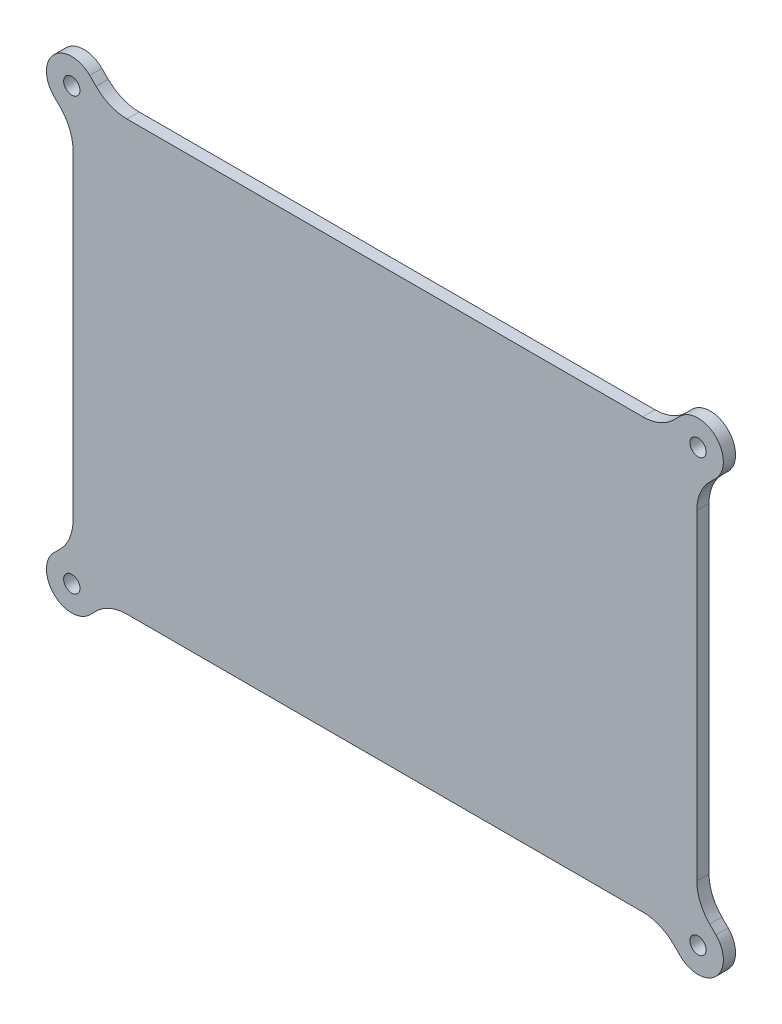
ISO-10303-21;
HEADER;
FILE_DESCRIPTION(('STEP AP214'),'2;1');
FILE_NAME('part.step','',(''),(''),'','','');
FILE_SCHEMA(('AUTOMOTIVE_DESIGN { 1 0 10303 214 1 1 1 1 }'));
ENDSEC;
DATA;
#1=APPLICATION_CONTEXT('core data for automotive mechanical design processes');
#2=APPLICATION_PROTOCOL_DEFINITION('international standard','automotive_design',2000,#1);
#3=PRODUCT_CONTEXT('',#1,'mechanical');
#4=PRODUCT('Part','Part','',(#3));
#5=PRODUCT_RELATED_PRODUCT_CATEGORY('part','',(#4));
#6=PRODUCT_DEFINITION_FORMATION('','',#4);
#7=PRODUCT_DEFINITION_CONTEXT('part definition',#1,'design');
#8=PRODUCT_DEFINITION('design','',#6,#7);
#9=PRODUCT_DEFINITION_SHAPE('','',#8);
#10=(LENGTH_UNIT() NAMED_UNIT(*) SI_UNIT(.MILLI.,.METRE.));
#11=(NAMED_UNIT(*) PLANE_ANGLE_UNIT() SI_UNIT($,.RADIAN.));
#12=(NAMED_UNIT(*) SI_UNIT($,.STERADIAN.) SOLID_ANGLE_UNIT());
#13=UNCERTAINTY_MEASURE_WITH_UNIT(LENGTH_MEASURE(1.E-05),#10,'distance_accuracy_value','');
#14=(GEOMETRIC_REPRESENTATION_CONTEXT(3) GLOBAL_UNCERTAINTY_ASSIGNED_CONTEXT((#13)) GLOBAL_UNIT_ASSIGNED_CONTEXT((#10,
#11,#12)) REPRESENTATION_CONTEXT('',''));
#15=CARTESIAN_POINT('',(0.,0.,0.));
#16=DIRECTION('',(0.,0.,1.));
#17=DIRECTION('',(1.,0.,0.));
#18=AXIS2_PLACEMENT_3D('',#15,#16,#17);
#19=CARTESIAN_POINT('',(-97.9904058691495,44.1022295903228,3.175));
#20=DIRECTION('',(0.,0.,1.));
#21=DIRECTION('',(1.,0.,0.));
#22=AXIS2_PLACEMENT_3D('',#19,#20,#21);
#23=PLANE('',#22);
#24=CARTESIAN_POINT('',(76.3077478034919,-53.8810036649023,3.175));
#25=DIRECTION('',(0.,0.,1.));
#26=DIRECTION('',(1.,0.,0.));
#27=AXIS2_PLACEMENT_3D('',#24,#25,#26);
#28=CIRCLE('',#27,2.125);
#29=CARTESIAN_POINT('',(78.4327478034919,-53.8810036649023,3.175));
#30=VERTEX_POINT('',#29);
#31=EDGE_CURVE('E453',#30,#30,#28,.T.);
#32=ORIENTED_EDGE('',*,*,#31,.F.);
#33=EDGE_LOOP('',(#32));
#34=FACE_BOUND('',#33,.T.);
#35=CARTESIAN_POINT('',(-86.868559541791,58.4953036803807,3.175));
#36=DIRECTION('',(0.,0.,1.));
#37=DIRECTION('',(1.,0.,0.));
#38=AXIS2_PLACEMENT_3D('',#35,#36,#37);
#39=CIRCLE('',#38,2.125);
#40=CARTESIAN_POINT('',(-84.743559541791,58.4953036803807,3.175));
#41=VERTEX_POINT('',#40);
#42=EDGE_CURVE('E236',#41,#41,#39,.T.);
#43=ORIENTED_EDGE('',*,*,#42,.F.);
#44=EDGE_LOOP('',(#43));
#45=FACE_BOUND('',#44,.T.);
#46=CARTESIAN_POINT('',(-97.9904058691495,44.1022295903228,3.175));
#47=DIRECTION('',(0.,0.,-1.));
#48=DIRECTION('',(1.,0.,0.));
#49=AXIS2_PLACEMENT_3D('',#46,#47,#48);
#50=CIRCLE('',#49,11.43);
#51=CARTESIAN_POINT('',(-89.9081753601873,52.1844600992851,3.175));
#52=VERTEX_POINT('',#51);
#53=CARTESIAN_POINT('',(-86.5604058691495,44.1022295903228,3.175));
#54=VERTEX_POINT('',#53);
#55=EDGE_CURVE('E279',#52,#54,#50,.T.);
#56=ORIENTED_EDGE('',*,*,#55,.T.);
#57=DIRECTION('',(0.,-1.,0.));
#58=VECTOR('',#57,1.);
#59=CARTESIAN_POINT('',(-86.5604058691495,44.1022295903228,3.175));
#60=LINE('',#59,#58);
#61=CARTESIAN_POINT('',(-86.5604058691495,-39.4879295748445,3.175));
#62=VERTEX_POINT('',#61);
#63=EDGE_CURVE('E147',#54,#62,#60,.T.);
#64=ORIENTED_EDGE('',*,*,#63,.T.);
#65=CARTESIAN_POINT('',(-97.9904058691495,-39.4879295748445,3.175));
#66=DIRECTION('',(0.,0.,-1.));
#67=DIRECTION('',(1.,0.,0.));
#68=AXIS2_PLACEMENT_3D('',#65,#66,#67);
#69=CIRCLE('',#68,11.43);
#70=CARTESIAN_POINT('',(-89.9081753601873,-47.5701600838067,3.175));
#71=VERTEX_POINT('',#70);
#72=EDGE_CURVE('E342',#62,#71,#69,.T.);
#73=ORIENTED_EDGE('',*,*,#72,.T.);
#74=DIRECTION('',(-0.707106781186546,-0.707106781186549,0.));
#75=VECTOR('',#74,1.);
#76=CARTESIAN_POINT('',(-91.543789241537,-49.2057739651564,3.175));
#77=LINE('',#76,#75);
#78=CARTESIAN_POINT('',(-91.543789241537,-49.2057739651564,3.175));
#79=VERTEX_POINT('',#78);
#80=EDGE_CURVE('E361',#71,#79,#77,.T.);
#81=ORIENTED_EDGE('',*,*,#80,.T.);
#82=CARTESIAN_POINT('',(-86.868559541791,-53.8810036649023,3.175));
#83=DIRECTION('',(0.,0.,1.));
#84=DIRECTION('',(1.,0.,0.));
#85=AXIS2_PLACEMENT_3D('',#82,#83,#84);
#86=CIRCLE('',#85,6.61177324859019);
#87=CARTESIAN_POINT('',(-82.1933298420451,-58.5562333646482,3.175));
#88=VERTEX_POINT('',#87);
#89=EDGE_CURVE('E358',#79,#88,#86,.T.);
#90=ORIENTED_EDGE('',*,*,#89,.T.);
#91=DIRECTION('',(0.707106781186548,0.707106781186548,0.));
#92=VECTOR('',#91,1.);
#93=CARTESIAN_POINT('',(-82.1933298420451,-58.5562333646482,3.175));
#94=LINE('',#93,#92);
#95=CARTESIAN_POINT('',(-80.5577159606955,-56.9206194832986,3.175));
#96=VERTEX_POINT('',#95);
#97=EDGE_CURVE('E360',#88,#96,#94,.T.);
#98=ORIENTED_EDGE('',*,*,#97,.T.);
#99=CARTESIAN_POINT('',(-72.4754854517332,-65.0028499922608,3.175));
#100=DIRECTION('',(0.,0.,-1.));
#101=DIRECTION('',(1.,0.,0.));
#102=AXIS2_PLACEMENT_3D('',#99,#100,#101);
#103=CIRCLE('',#102,11.43);
#104=CARTESIAN_POINT('',(-72.4754854517333,-53.5728499922608,3.175));
#105=VERTEX_POINT('',#104);
#106=EDGE_CURVE('E363',#96,#105,#103,.T.);
#107=ORIENTED_EDGE('',*,*,#106,.T.);
#108=DIRECTION('',(1.,0.,0.));
#109=VECTOR('',#108,1.);
#110=CARTESIAN_POINT('',(61.9146737134341,-53.5728499922608,3.175));
#111=LINE('',#110,#109);
#112=CARTESIAN_POINT('',(61.9146737134341,-53.5728499922608,3.175));
#113=VERTEX_POINT('',#112);
#114=EDGE_CURVE('E369',#105,#113,#111,.T.);
#115=ORIENTED_EDGE('',*,*,#114,.T.);
#116=CARTESIAN_POINT('',(61.9146737134341,-65.0028499922608,3.175));
#117=DIRECTION('',(0.,0.,-1.));
#118=DIRECTION('',(1.,0.,0.));
#119=AXIS2_PLACEMENT_3D('',#116,#117,#118);
#120=CIRCLE('',#119,11.43);
#121=CARTESIAN_POINT('',(69.9969042223963,-56.9206194832986,3.175));
#122=VERTEX_POINT('',#121);
#123=EDGE_CURVE('E371',#113,#122,#120,.T.);
#124=ORIENTED_EDGE('',*,*,#123,.T.);
#125=DIRECTION('',(0.707106781186548,-0.707106781186548,0.));
#126=VECTOR('',#125,1.);
#127=CARTESIAN_POINT('',(71.632518103746,-58.5562333646482,3.175));
#128=LINE('',#127,#126);
#129=CARTESIAN_POINT('',(71.632518103746,-58.5562333646482,3.175));
#130=VERTEX_POINT('',#129);
#131=EDGE_CURVE('E373',#122,#130,#128,.T.);
#132=ORIENTED_EDGE('',*,*,#131,.T.);
#133=CARTESIAN_POINT('',(76.3077478034919,-53.8810036649023,3.175));
#134=DIRECTION('',(0.,0.,1.));
#135=DIRECTION('',(1.,0.,0.));
#136=AXIS2_PLACEMENT_3D('',#133,#134,#135);
#137=CIRCLE('',#136,6.61177324859019);
#138=CARTESIAN_POINT('',(80.9829775032378,-49.2057739651564,3.175));
#139=VERTEX_POINT('',#138);
#140=EDGE_CURVE('E375',#130,#139,#137,.T.);
#141=ORIENTED_EDGE('',*,*,#140,.T.);
#142=DIRECTION('',(-0.707106781186546,0.707106781186549,0.));
#143=VECTOR('',#142,1.);
#144=CARTESIAN_POINT('',(80.9829775032378,-49.2057739651564,3.175));
#145=LINE('',#144,#143);
#146=CARTESIAN_POINT('',(79.3473636218882,-47.5701600838068,3.175));
#147=VERTEX_POINT('',#146);
#148=EDGE_CURVE('E377',#139,#147,#145,.T.);
#149=ORIENTED_EDGE('',*,*,#148,.T.);
#150=CARTESIAN_POINT('',(87.4295941308505,-39.4879295748445,3.175));
#151=DIRECTION('',(0.,0.,-1.));
#152=DIRECTION('',(1.,0.,0.));
#153=AXIS2_PLACEMENT_3D('',#150,#151,#152);
#154=CIRCLE('',#153,11.43);
#155=CARTESIAN_POINT('',(75.9995941308505,-39.4879295748445,3.175));
#156=VERTEX_POINT('',#155);
#157=EDGE_CURVE('E379',#147,#156,#154,.T.);
#158=ORIENTED_EDGE('',*,*,#157,.T.);
#159=DIRECTION('',(0.,1.,0.));
#160=VECTOR('',#159,1.);
#161=CARTESIAN_POINT('',(75.9995941308505,44.1022295903229,3.175));
#162=LINE('',#161,#160);
#163=CARTESIAN_POINT('',(75.9995941308505,44.1022295903229,3.175));
#164=VERTEX_POINT('',#163);
#165=EDGE_CURVE('E381',#156,#164,#162,.T.);
#166=ORIENTED_EDGE('',*,*,#165,.T.);
#167=CARTESIAN_POINT('',(87.4295941308505,44.1022295903229,3.175));
#168=DIRECTION('',(0.,0.,-1.));
#169=DIRECTION('',(1.,0.,0.));
#170=AXIS2_PLACEMENT_3D('',#167,#168,#169);
#171=CIRCLE('',#170,11.43);
#172=CARTESIAN_POINT('',(79.3473636218882,52.1844600992851,3.175));
#173=VERTEX_POINT('',#172);
#174=EDGE_CURVE('E383',#164,#173,#171,.T.);
#175=ORIENTED_EDGE('',*,*,#174,.T.);
#176=DIRECTION('',(0.707106781186548,0.707106781186548,0.));
#177=VECTOR('',#176,1.);
#178=CARTESIAN_POINT('',(80.9829775032378,53.8200739806347,3.175));
#179=LINE('',#178,#177);
#180=CARTESIAN_POINT('',(80.9829775032378,53.8200739806347,3.175));
#181=VERTEX_POINT('',#180);
#182=EDGE_CURVE('E385',#173,#181,#179,.T.);
#183=ORIENTED_EDGE('',*,*,#182,.T.);
#184=CARTESIAN_POINT('',(76.3077478034919,58.4953036803807,3.175));
#185=DIRECTION('',(0.,0.,1.));
#186=DIRECTION('',(1.,0.,0.));
#187=AXIS2_PLACEMENT_3D('',#184,#185,#186);
#188=CIRCLE('',#187,6.61177324859019);
#189=CARTESIAN_POINT('',(71.632518103746,63.1705333801266,3.175));
#190=VERTEX_POINT('',#189);
#191=EDGE_CURVE('E387',#181,#190,#188,.T.);
#192=ORIENTED_EDGE('',*,*,#191,.T.);
#193=DIRECTION('',(-0.707106781186546,-0.707106781186549,0.));
#194=VECTOR('',#193,1.);
#195=CARTESIAN_POINT('',(71.632518103746,63.1705333801266,3.175));
#196=LINE('',#195,#194);
#197=CARTESIAN_POINT('',(69.9969042223963,61.534919498777,3.175));
#198=VERTEX_POINT('',#197);
#199=EDGE_CURVE('E389',#190,#198,#196,.T.);
#200=ORIENTED_EDGE('',*,*,#199,.T.);
#201=CARTESIAN_POINT('',(61.9146737134341,69.6171500077392,3.175));
#202=DIRECTION('',(0.,0.,-1.));
#203=DIRECTION('',(1.,0.,0.));
#204=AXIS2_PLACEMENT_3D('',#201,#202,#203);
#205=CIRCLE('',#204,11.43);
#206=CARTESIAN_POINT('',(61.9146737134341,58.1871500077392,3.175));
#207=VERTEX_POINT('',#206);
#208=EDGE_CURVE('E391',#198,#207,#205,.T.);
#209=ORIENTED_EDGE('',*,*,#208,.T.);
#210=DIRECTION('',(-1.,0.,0.));
#211=VECTOR('',#210,1.);
#212=CARTESIAN_POINT('',(61.9146737134341,58.1871500077392,3.175));
#213=LINE('',#212,#211);
#214=CARTESIAN_POINT('',(-72.4754854517332,58.1871500077392,3.175));
#215=VERTEX_POINT('',#214);
#216=EDGE_CURVE('E393',#207,#215,#213,.T.);
#217=ORIENTED_EDGE('',*,*,#216,.T.);
#218=CARTESIAN_POINT('',(-72.4754854517332,69.6171500077392,3.175));
#219=DIRECTION('',(0.,0.,-1.));
#220=DIRECTION('',(1.,0.,0.));
#221=AXIS2_PLACEMENT_3D('',#218,#219,#220);
#222=CIRCLE('',#221,11.43);
#223=CARTESIAN_POINT('',(-80.5577159606955,61.5349194987769,3.175));
#224=VERTEX_POINT('',#223);
#225=EDGE_CURVE('E214',#215,#224,#222,.T.);
#226=ORIENTED_EDGE('',*,*,#225,.T.);
#227=DIRECTION('',(-0.707106781186546,0.707106781186549,0.));
#228=VECTOR('',#227,1.);
#229=CARTESIAN_POINT('',(-82.1933298420451,63.1705333801266,3.175));
#230=LINE('',#229,#228);
#231=CARTESIAN_POINT('',(-82.1933298420451,63.1705333801266,3.175));
#232=VERTEX_POINT('',#231);
#233=EDGE_CURVE('E208',#224,#232,#230,.T.);
#234=ORIENTED_EDGE('',*,*,#233,.T.);
#235=CARTESIAN_POINT('',(-86.868559541791,58.4953036803807,3.175));
#236=DIRECTION('',(0.,0.,1.));
#237=DIRECTION('',(1.,0.,0.));
#238=AXIS2_PLACEMENT_3D('',#235,#236,#237);
#239=CIRCLE('',#238,6.61177324859019);
#240=CARTESIAN_POINT('',(-91.543789241537,53.8200739806347,3.175));
#241=VERTEX_POINT('',#240);
#242=EDGE_CURVE('E212',#232,#241,#239,.T.);
#243=ORIENTED_EDGE('',*,*,#242,.T.);
#244=DIRECTION('',(0.707106781186548,-0.707106781186548,0.));
#245=VECTOR('',#244,1.);
#246=CARTESIAN_POINT('',(-91.543789241537,53.8200739806347,3.175));
#247=LINE('',#246,#245);
#248=EDGE_CURVE('E56',#241,#52,#247,.T.);
#249=ORIENTED_EDGE('',*,*,#248,.T.);
#250=EDGE_LOOP('',(#56,#64,#73,#81,#90,#98,#107,#115,#124,#132,#141,#149,#158,#166,#175,#183,
#192,#200,#209,#217,#226,#234,#243,#249));
#251=FACE_BOUND('',#250,.T.);
#252=CARTESIAN_POINT('',(76.3077478034919,58.4953036803807,3.175));
#253=DIRECTION('',(0.,0.,1.));
#254=DIRECTION('',(1.,0.,0.));
#255=AXIS2_PLACEMENT_3D('',#252,#253,#254);
#256=CIRCLE('',#255,2.125);
#257=CARTESIAN_POINT('',(78.4327478034919,58.4953036803807,3.175));
#258=VERTEX_POINT('',#257);
#259=EDGE_CURVE('E459',#258,#258,#256,.T.);
#260=ORIENTED_EDGE('',*,*,#259,.F.);
#261=EDGE_LOOP('',(#260));
#262=FACE_BOUND('',#261,.T.);
#263=CARTESIAN_POINT('',(-86.868559541791,-53.8810036649023,3.175));
#264=DIRECTION('',(0.,0.,1.));
#265=DIRECTION('',(1.,0.,0.));
#266=AXIS2_PLACEMENT_3D('',#263,#264,#265);
#267=CIRCLE('',#266,2.125);
#268=CARTESIAN_POINT('',(-84.743559541791,-53.8810036649023,3.175));
#269=VERTEX_POINT('',#268);
#270=EDGE_CURVE('E444',#269,#269,#267,.T.);
#271=ORIENTED_EDGE('',*,*,#270,.F.);
#272=EDGE_LOOP('',(#271));
#273=FACE_BOUND('',#272,.T.);
#274=ADVANCED_FACE('F39',(#34,#45,#251,#262,#273),#23,.T.);
#275=CARTESIAN_POINT('',(-97.9904058691495,44.1022295903228,0.));
#276=DIRECTION('',(0.,0.,1.));
#277=DIRECTION('',(1.,0.,0.));
#278=AXIS2_PLACEMENT_3D('',#275,#276,#277);
#279=PLANE('',#278);
#280=CARTESIAN_POINT('',(-97.9904058691495,44.1022295903228,0.));
#281=DIRECTION('',(0.,0.,-1.));
#282=DIRECTION('',(1.,0.,0.));
#283=AXIS2_PLACEMENT_3D('',#280,#281,#282);
#284=CIRCLE('',#283,11.43);
#285=CARTESIAN_POINT('',(-89.9081753601873,52.1844600992851,0.));
#286=VERTEX_POINT('',#285);
#287=CARTESIAN_POINT('',(-86.5604058691495,44.1022295903228,0.));
#288=VERTEX_POINT('',#287);
#289=EDGE_CURVE('E232',#286,#288,#284,.T.);
#290=ORIENTED_EDGE('',*,*,#289,.F.);
#291=DIRECTION('',(0.707106781186548,-0.707106781186548,0.));
#292=VECTOR('',#291,1.);
#293=CARTESIAN_POINT('',(-91.543789241537,53.8200739806347,0.));
#294=LINE('',#293,#292);
#295=CARTESIAN_POINT('',(-91.543789241537,53.8200739806347,0.));
#296=VERTEX_POINT('',#295);
#297=EDGE_CURVE('E139',#296,#286,#294,.T.);
#298=ORIENTED_EDGE('',*,*,#297,.F.);
#299=CARTESIAN_POINT('',(-86.868559541791,58.4953036803807,0.));
#300=DIRECTION('',(0.,0.,1.));
#301=DIRECTION('',(1.,0.,0.));
#302=AXIS2_PLACEMENT_3D('',#299,#300,#301);
#303=CIRCLE('',#302,6.61177324859019);
#304=CARTESIAN_POINT('',(-82.1933298420451,63.1705333801266,0.));
#305=VERTEX_POINT('',#304);
#306=EDGE_CURVE('E133',#305,#296,#303,.T.);
#307=ORIENTED_EDGE('',*,*,#306,.F.);
#308=DIRECTION('',(-0.707106781186546,0.707106781186549,0.));
#309=VECTOR('',#308,1.);
#310=CARTESIAN_POINT('',(-82.1933298420451,63.1705333801266,0.));
#311=LINE('',#310,#309);
#312=CARTESIAN_POINT('',(-80.5577159606955,61.5349194987769,0.));
#313=VERTEX_POINT('',#312);
#314=EDGE_CURVE('E222',#313,#305,#311,.T.);
#315=ORIENTED_EDGE('',*,*,#314,.F.);
#316=CARTESIAN_POINT('',(-72.4754854517332,69.6171500077392,0.));
#317=DIRECTION('',(0.,0.,-1.));
#318=DIRECTION('',(1.,0.,0.));
#319=AXIS2_PLACEMENT_3D('',#316,#317,#318);
#320=CIRCLE('',#319,11.43);
#321=CARTESIAN_POINT('',(-72.4754854517332,58.1871500077392,0.));
#322=VERTEX_POINT('',#321);
#323=EDGE_CURVE('E274',#322,#313,#320,.T.);
#324=ORIENTED_EDGE('',*,*,#323,.F.);
#325=DIRECTION('',(-1.,0.,0.));
#326=VECTOR('',#325,1.);
#327=CARTESIAN_POINT('',(61.9146737134341,58.1871500077392,0.));
#328=LINE('',#327,#326);
#329=CARTESIAN_POINT('',(61.9146737134341,58.1871500077392,0.));
#330=VERTEX_POINT('',#329);
#331=EDGE_CURVE('E272',#330,#322,#328,.T.);
#332=ORIENTED_EDGE('',*,*,#331,.F.);
#333=CARTESIAN_POINT('',(61.9146737134341,69.6171500077392,0.));
#334=DIRECTION('',(0.,0.,-1.));
#335=DIRECTION('',(1.,0.,0.));
#336=AXIS2_PLACEMENT_3D('',#333,#334,#335);
#337=CIRCLE('',#336,11.43);
#338=CARTESIAN_POINT('',(69.9969042223963,61.534919498777,0.));
#339=VERTEX_POINT('',#338);
#340=EDGE_CURVE('E270',#339,#330,#337,.T.);
#341=ORIENTED_EDGE('',*,*,#340,.F.);
#342=DIRECTION('',(-0.707106781186546,-0.707106781186549,0.));
#343=VECTOR('',#342,1.);
#344=CARTESIAN_POINT('',(71.632518103746,63.1705333801266,0.));
#345=LINE('',#344,#343);
#346=CARTESIAN_POINT('',(71.632518103746,63.1705333801266,0.));
#347=VERTEX_POINT('',#346);
#348=EDGE_CURVE('E268',#347,#339,#345,.T.);
#349=ORIENTED_EDGE('',*,*,#348,.F.);
#350=CARTESIAN_POINT('',(76.3077478034919,58.4953036803807,0.));
#351=DIRECTION('',(0.,0.,1.));
#352=DIRECTION('',(1.,0.,0.));
#353=AXIS2_PLACEMENT_3D('',#350,#351,#352);
#354=CIRCLE('',#353,6.61177324859019);
#355=CARTESIAN_POINT('',(80.9829775032378,53.8200739806347,0.));
#356=VERTEX_POINT('',#355);
#357=EDGE_CURVE('E266',#356,#347,#354,.T.);
#358=ORIENTED_EDGE('',*,*,#357,.F.);
#359=DIRECTION('',(0.707106781186548,0.707106781186548,0.));
#360=VECTOR('',#359,1.);
#361=CARTESIAN_POINT('',(80.9829775032378,53.8200739806347,0.));
#362=LINE('',#361,#360);
#363=CARTESIAN_POINT('',(79.3473636218882,52.1844600992851,0.));
#364=VERTEX_POINT('',#363);
#365=EDGE_CURVE('E264',#364,#356,#362,.T.);
#366=ORIENTED_EDGE('',*,*,#365,.F.);
#367=CARTESIAN_POINT('',(87.4295941308505,44.1022295903229,0.));
#368=DIRECTION('',(0.,0.,-1.));
#369=DIRECTION('',(1.,0.,0.));
#370=AXIS2_PLACEMENT_3D('',#367,#368,#369);
#371=CIRCLE('',#370,11.43);
#372=CARTESIAN_POINT('',(75.9995941308505,44.1022295903229,0.));
#373=VERTEX_POINT('',#372);
#374=EDGE_CURVE('E262',#373,#364,#371,.T.);
#375=ORIENTED_EDGE('',*,*,#374,.F.);
#376=DIRECTION('',(0.,1.,0.));
#377=VECTOR('',#376,1.);
#378=CARTESIAN_POINT('',(75.9995941308505,44.1022295903229,0.));
#379=LINE('',#378,#377);
#380=CARTESIAN_POINT('',(75.9995941308505,-39.4879295748445,0.));
#381=VERTEX_POINT('',#380);
#382=EDGE_CURVE('E260',#381,#373,#379,.T.);
#383=ORIENTED_EDGE('',*,*,#382,.F.);
#384=CARTESIAN_POINT('',(87.4295941308505,-39.4879295748445,0.));
#385=DIRECTION('',(0.,0.,-1.));
#386=DIRECTION('',(1.,0.,0.));
#387=AXIS2_PLACEMENT_3D('',#384,#385,#386);
#388=CIRCLE('',#387,11.43);
#389=CARTESIAN_POINT('',(79.3473636218882,-47.5701600838068,0.));
#390=VERTEX_POINT('',#389);
#391=EDGE_CURVE('E258',#390,#381,#388,.T.);
#392=ORIENTED_EDGE('',*,*,#391,.F.);
#393=DIRECTION('',(-0.707106781186546,0.707106781186549,0.));
#394=VECTOR('',#393,1.);
#395=CARTESIAN_POINT('',(80.9829775032378,-49.2057739651564,0.));
#396=LINE('',#395,#394);
#397=CARTESIAN_POINT('',(80.9829775032378,-49.2057739651564,0.));
#398=VERTEX_POINT('',#397);
#399=EDGE_CURVE('E256',#398,#390,#396,.T.);
#400=ORIENTED_EDGE('',*,*,#399,.F.);
#401=CARTESIAN_POINT('',(76.3077478034919,-53.8810036649023,0.));
#402=DIRECTION('',(0.,0.,1.));
#403=DIRECTION('',(1.,0.,0.));
#404=AXIS2_PLACEMENT_3D('',#401,#402,#403);
#405=CIRCLE('',#404,6.61177324859019);
#406=CARTESIAN_POINT('',(71.632518103746,-58.5562333646482,0.));
#407=VERTEX_POINT('',#406);
#408=EDGE_CURVE('E254',#407,#398,#405,.T.);
#409=ORIENTED_EDGE('',*,*,#408,.F.);
#410=DIRECTION('',(0.707106781186548,-0.707106781186548,0.));
#411=VECTOR('',#410,1.);
#412=CARTESIAN_POINT('',(71.632518103746,-58.5562333646482,0.));
#413=LINE('',#412,#411);
#414=CARTESIAN_POINT('',(69.9969042223963,-56.9206194832986,0.));
#415=VERTEX_POINT('',#414);
#416=EDGE_CURVE('E252',#415,#407,#413,.T.);
#417=ORIENTED_EDGE('',*,*,#416,.F.);
#418=CARTESIAN_POINT('',(61.9146737134341,-65.0028499922608,0.));
#419=DIRECTION('',(0.,0.,-1.));
#420=DIRECTION('',(1.,0.,0.));
#421=AXIS2_PLACEMENT_3D('',#418,#419,#420);
#422=CIRCLE('',#421,11.43);
#423=CARTESIAN_POINT('',(61.9146737134341,-53.5728499922608,0.));
#424=VERTEX_POINT('',#423);
#425=EDGE_CURVE('E250',#424,#415,#422,.T.);
#426=ORIENTED_EDGE('',*,*,#425,.F.);
#427=DIRECTION('',(1.,0.,0.));
#428=VECTOR('',#427,1.);
#429=CARTESIAN_POINT('',(61.9146737134341,-53.5728499922608,0.));
#430=LINE('',#429,#428);
#431=CARTESIAN_POINT('',(-72.4754854517333,-53.5728499922608,0.));
#432=VERTEX_POINT('',#431);
#433=EDGE_CURVE('E248',#432,#424,#430,.T.);
#434=ORIENTED_EDGE('',*,*,#433,.F.);
#435=CARTESIAN_POINT('',(-72.4754854517332,-65.0028499922608,0.));
#436=DIRECTION('',(0.,0.,-1.));
#437=DIRECTION('',(1.,0.,0.));
#438=AXIS2_PLACEMENT_3D('',#435,#436,#437);
#439=CIRCLE('',#438,11.43);
#440=CARTESIAN_POINT('',(-80.5577159606955,-56.9206194832986,0.));
#441=VERTEX_POINT('',#440);
#442=EDGE_CURVE('E246',#441,#432,#439,.T.);
#443=ORIENTED_EDGE('',*,*,#442,.F.);
#444=DIRECTION('',(0.707106781186548,0.707106781186548,0.));
#445=VECTOR('',#444,1.);
#446=CARTESIAN_POINT('',(-82.1933298420451,-58.5562333646482,0.));
#447=LINE('',#446,#445);
#448=CARTESIAN_POINT('',(-82.1933298420451,-58.5562333646482,0.));
#449=VERTEX_POINT('',#448);
#450=EDGE_CURVE('E244',#449,#441,#447,.T.);
#451=ORIENTED_EDGE('',*,*,#450,.F.);
#452=CARTESIAN_POINT('',(-86.868559541791,-53.8810036649023,0.));
#453=DIRECTION('',(0.,0.,1.));
#454=DIRECTION('',(1.,0.,0.));
#455=AXIS2_PLACEMENT_3D('',#452,#453,#454);
#456=CIRCLE('',#455,6.61177324859019);
#457=CARTESIAN_POINT('',(-91.543789241537,-49.2057739651564,0.));
#458=VERTEX_POINT('',#457);
#459=EDGE_CURVE('E242',#458,#449,#456,.T.);
#460=ORIENTED_EDGE('',*,*,#459,.F.);
#461=DIRECTION('',(-0.707106781186546,-0.707106781186549,0.));
#462=VECTOR('',#461,1.);
#463=CARTESIAN_POINT('',(-91.543789241537,-49.2057739651564,0.));
#464=LINE('',#463,#462);
#465=CARTESIAN_POINT('',(-89.9081753601873,-47.5701600838067,0.));
#466=VERTEX_POINT('',#465);
#467=EDGE_CURVE('E240',#466,#458,#464,.T.);
#468=ORIENTED_EDGE('',*,*,#467,.F.);
#469=CARTESIAN_POINT('',(-97.9904058691495,-39.4879295748445,0.));
#470=DIRECTION('',(0.,0.,-1.));
#471=DIRECTION('',(1.,0.,0.));
#472=AXIS2_PLACEMENT_3D('',#469,#470,#471);
#473=CIRCLE('',#472,11.43);
#474=CARTESIAN_POINT('',(-86.5604058691495,-39.4879295748445,0.));
#475=VERTEX_POINT('',#474);
#476=EDGE_CURVE('E238',#475,#466,#473,.T.);
#477=ORIENTED_EDGE('',*,*,#476,.F.);
#478=DIRECTION('',(0.,-1.,0.));
#479=VECTOR('',#478,1.);
#480=CARTESIAN_POINT('',(-86.5604058691495,44.1022295903228,0.));
#481=LINE('',#480,#479);
#482=EDGE_CURVE('E235',#288,#475,#481,.T.);
#483=ORIENTED_EDGE('',*,*,#482,.F.);
#484=EDGE_LOOP('',(#290,#298,#307,#315,#324,#332,#341,#349,#358,#366,#375,#383,#392,#400,#409,
#417,#426,#434,#443,#451,#460,#468,#477,#483));
#485=FACE_BOUND('',#484,.T.);
#486=CARTESIAN_POINT('',(-86.868559541791,58.4953036803807,0.));
#487=DIRECTION('',(0.,0.,1.));
#488=DIRECTION('',(1.,0.,0.));
#489=AXIS2_PLACEMENT_3D('',#486,#487,#488);
#490=CIRCLE('',#489,2.125);
#491=CARTESIAN_POINT('',(-84.743559541791,58.4953036803807,0.));
#492=VERTEX_POINT('',#491);
#493=EDGE_CURVE('E462',#492,#492,#490,.T.);
#494=ORIENTED_EDGE('',*,*,#493,.T.);
#495=EDGE_LOOP('',(#494));
#496=FACE_BOUND('',#495,.T.);
#497=CARTESIAN_POINT('',(76.3077478034919,58.4953036803807,0.));
#498=DIRECTION('',(0.,0.,1.));
#499=DIRECTION('',(1.,0.,0.));
#500=AXIS2_PLACEMENT_3D('',#497,#498,#499);
#501=CIRCLE('',#500,2.125);
#502=CARTESIAN_POINT('',(78.4327478034919,58.4953036803807,0.));
#503=VERTEX_POINT('',#502);
#504=EDGE_CURVE('E456',#503,#503,#501,.T.);
#505=ORIENTED_EDGE('',*,*,#504,.T.);
#506=EDGE_LOOP('',(#505));
#507=FACE_BOUND('',#506,.T.);
#508=CARTESIAN_POINT('',(76.3077478034919,-53.8810036649023,0.));
#509=DIRECTION('',(0.,0.,1.));
#510=DIRECTION('',(1.,0.,0.));
#511=AXIS2_PLACEMENT_3D('',#508,#509,#510);
#512=CIRCLE('',#511,2.125);
#513=CARTESIAN_POINT('',(78.4327478034919,-53.8810036649023,0.));
#514=VERTEX_POINT('',#513);
#515=EDGE_CURVE('E450',#514,#514,#512,.T.);
#516=ORIENTED_EDGE('',*,*,#515,.T.);
#517=EDGE_LOOP('',(#516));
#518=FACE_BOUND('',#517,.T.);
#519=CARTESIAN_POINT('',(-86.868559541791,-53.8810036649023,0.));
#520=DIRECTION('',(0.,0.,1.));
#521=DIRECTION('',(1.,0.,0.));
#522=AXIS2_PLACEMENT_3D('',#519,#520,#521);
#523=CIRCLE('',#522,2.125);
#524=CARTESIAN_POINT('',(-84.743559541791,-53.8810036649023,0.));
#525=VERTEX_POINT('',#524);
#526=EDGE_CURVE('E447',#525,#525,#523,.T.);
#527=ORIENTED_EDGE('',*,*,#526,.T.);
#528=EDGE_LOOP('',(#527));
#529=FACE_BOUND('',#528,.T.);
#530=ADVANCED_FACE('F346',(#485,#496,#507,#518,#529),#279,.F.);
#531=CARTESIAN_POINT('',(-97.9904058691495,44.1022295903228,3.175));
#532=DIRECTION('',(0.,0.,-1.));
#533=DIRECTION('',(-1.,0.,0.));
#534=AXIS2_PLACEMENT_3D('',#531,#532,#533);
#535=CYLINDRICAL_SURFACE('',#534,11.43);
#536=ORIENTED_EDGE('',*,*,#289,.T.);
#537=DIRECTION('',(0.,0.,-1.));
#538=VECTOR('',#537,1.);
#539=CARTESIAN_POINT('',(-86.5604058691495,44.1022295903228,3.175));
#540=LINE('',#539,#538);
#541=EDGE_CURVE('E11',#54,#288,#540,.T.);
#542=ORIENTED_EDGE('',*,*,#541,.F.);
#543=ORIENTED_EDGE('',*,*,#55,.F.);
#544=DIRECTION('',(0.,0.,-1.));
#545=VECTOR('',#544,1.);
#546=CARTESIAN_POINT('',(-89.9081753601873,52.1844600992851,3.175));
#547=LINE('',#546,#545);
#548=EDGE_CURVE('E228',#52,#286,#547,.T.);
#549=ORIENTED_EDGE('',*,*,#548,.T.);
#550=EDGE_LOOP('',(#536,#542,#543,#549));
#551=FACE_BOUND('',#550,.T.);
#552=ADVANCED_FACE('F41',(#551),#535,.F.);
#553=CARTESIAN_POINT('',(-86.5604058691495,44.1022295903228,3.175));
#554=DIRECTION('',(1.,0.,0.));
#555=DIRECTION('',(0.,1.,0.));
#556=AXIS2_PLACEMENT_3D('',#553,#554,#555);
#557=PLANE('',#556);
#558=ORIENTED_EDGE('',*,*,#482,.T.);
#559=DIRECTION('',(0.,0.,-1.));
#560=VECTOR('',#559,1.);
#561=CARTESIAN_POINT('',(-86.5604058691495,-39.4879295748445,3.175));
#562=LINE('',#561,#560);
#563=EDGE_CURVE('E48',#62,#475,#562,.T.);
#564=ORIENTED_EDGE('',*,*,#563,.F.);
#565=ORIENTED_EDGE('',*,*,#63,.F.);
#566=ORIENTED_EDGE('',*,*,#541,.T.);
#567=EDGE_LOOP('',(#558,#564,#565,#566));
#568=FACE_BOUND('',#567,.T.);
#569=ADVANCED_FACE('F696',(#568),#557,.F.);
#570=CARTESIAN_POINT('',(-97.9904058691495,-39.4879295748445,3.175));
#571=DIRECTION('',(0.,0.,-1.));
#572=DIRECTION('',(-1.,0.,0.));
#573=AXIS2_PLACEMENT_3D('',#570,#571,#572);
#574=CYLINDRICAL_SURFACE('',#573,11.43);
#575=ORIENTED_EDGE('',*,*,#476,.T.);
#576=DIRECTION('',(0.,0.,-1.));
#577=VECTOR('',#576,1.);
#578=CARTESIAN_POINT('',(-89.9081753601873,-47.5701600838067,3.175));
#579=LINE('',#578,#577);
#580=EDGE_CURVE('E334',#71,#466,#579,.T.);
#581=ORIENTED_EDGE('',*,*,#580,.F.);
#582=ORIENTED_EDGE('',*,*,#72,.F.);
#583=ORIENTED_EDGE('',*,*,#563,.T.);
#584=EDGE_LOOP('',(#575,#581,#582,#583));
#585=FACE_BOUND('',#584,.T.);
#586=ADVANCED_FACE('F340',(#585),#574,.F.);
#587=CARTESIAN_POINT('',(-91.543789241537,-49.2057739651564,3.175));
#588=DIRECTION('',(0.707106781186549,-0.707106781186546,0.));
#589=DIRECTION('',(0.707106781186546,0.707106781186549,0.));
#590=AXIS2_PLACEMENT_3D('',#587,#588,#589);
#591=PLANE('',#590);
#592=ORIENTED_EDGE('',*,*,#467,.T.);
#593=DIRECTION('',(0.,0.,-1.));
#594=VECTOR('',#593,1.);
#595=CARTESIAN_POINT('',(-91.543789241537,-49.2057739651564,3.175));
#596=LINE('',#595,#594);
#597=EDGE_CURVE('E331',#79,#458,#596,.T.);
#598=ORIENTED_EDGE('',*,*,#597,.F.);
#599=ORIENTED_EDGE('',*,*,#80,.F.);
#600=ORIENTED_EDGE('',*,*,#580,.T.);
#601=EDGE_LOOP('',(#592,#598,#599,#600));
#602=FACE_BOUND('',#601,.T.);
#603=ADVANCED_FACE('F352',(#602),#591,.F.);
#604=CARTESIAN_POINT('',(-86.868559541791,-53.8810036649023,3.175));
#605=DIRECTION('',(0.,0.,-1.));
#606=DIRECTION('',(-1.,0.,0.));
#607=AXIS2_PLACEMENT_3D('',#604,#605,#606);
#608=CYLINDRICAL_SURFACE('',#607,6.61177324859019);
#609=ORIENTED_EDGE('',*,*,#459,.T.);
#610=DIRECTION('',(0.,0.,-1.));
#611=VECTOR('',#610,1.);
#612=CARTESIAN_POINT('',(-82.1933298420451,-58.5562333646482,3.175));
#613=LINE('',#612,#611);
#614=EDGE_CURVE('E328',#88,#449,#613,.T.);
#615=ORIENTED_EDGE('',*,*,#614,.F.);
#616=ORIENTED_EDGE('',*,*,#89,.F.);
#617=ORIENTED_EDGE('',*,*,#597,.T.);
#618=EDGE_LOOP('',(#609,#615,#616,#617));
#619=FACE_BOUND('',#618,.T.);
#620=ADVANCED_FACE('F356',(#619),#608,.T.);
#621=CARTESIAN_POINT('',(-82.1933298420451,-58.5562333646482,3.175));
#622=DIRECTION('',(-0.707106781186548,0.707106781186548,0.));
#623=DIRECTION('',(-0.707106781186548,-0.707106781186548,0.));
#624=AXIS2_PLACEMENT_3D('',#621,#622,#623);
#625=PLANE('',#624);
#626=ORIENTED_EDGE('',*,*,#450,.T.);
#627=DIRECTION('',(0.,0.,-1.));
#628=VECTOR('',#627,1.);
#629=CARTESIAN_POINT('',(-80.5577159606955,-56.9206194832986,3.175));
#630=LINE('',#629,#628);
#631=EDGE_CURVE('E325',#96,#441,#630,.T.);
#632=ORIENTED_EDGE('',*,*,#631,.F.);
#633=ORIENTED_EDGE('',*,*,#97,.F.);
#634=ORIENTED_EDGE('',*,*,#614,.T.);
#635=EDGE_LOOP('',(#626,#632,#633,#634));
#636=FACE_BOUND('',#635,.T.);
#637=ADVANCED_FACE('F661',(#636),#625,.F.);
#638=CARTESIAN_POINT('',(-72.4754854517332,-65.0028499922608,3.175));
#639=DIRECTION('',(0.,0.,-1.));
#640=DIRECTION('',(-1.,0.,0.));
#641=AXIS2_PLACEMENT_3D('',#638,#639,#640);
#642=CYLINDRICAL_SURFACE('',#641,11.43);
#643=ORIENTED_EDGE('',*,*,#442,.T.);
#644=DIRECTION('',(0.,0.,-1.));
#645=VECTOR('',#644,1.);
#646=CARTESIAN_POINT('',(-72.4754854517333,-53.5728499922608,3.175));
#647=LINE('',#646,#645);
#648=EDGE_CURVE('E322',#105,#432,#647,.T.);
#649=ORIENTED_EDGE('',*,*,#648,.F.);
#650=ORIENTED_EDGE('',*,*,#106,.F.);
#651=ORIENTED_EDGE('',*,*,#631,.T.);
#652=EDGE_LOOP('',(#643,#649,#650,#651));
#653=FACE_BOUND('',#652,.T.);
#654=ADVANCED_FACE('F651',(#653),#642,.F.);
#655=CARTESIAN_POINT('',(61.9146737134341,-53.5728499922608,3.175));
#656=DIRECTION('',(0.,1.,0.));
#657=DIRECTION('',(-1.,0.,0.));
#658=AXIS2_PLACEMENT_3D('',#655,#656,#657);
#659=PLANE('',#658);
#660=ORIENTED_EDGE('',*,*,#433,.T.);
#661=DIRECTION('',(0.,0.,-1.));
#662=VECTOR('',#661,1.);
#663=CARTESIAN_POINT('',(61.9146737134341,-53.5728499922608,3.175));
#664=LINE('',#663,#662);
#665=EDGE_CURVE('E319',#113,#424,#664,.T.);
#666=ORIENTED_EDGE('',*,*,#665,.F.);
#667=ORIENTED_EDGE('',*,*,#114,.F.);
#668=ORIENTED_EDGE('',*,*,#648,.T.);
#669=EDGE_LOOP('',(#660,#666,#667,#668));
#670=FACE_BOUND('',#669,.T.);
#671=ADVANCED_FACE('F641',(#670),#659,.F.);
#672=CARTESIAN_POINT('',(61.9146737134341,-65.0028499922608,3.175));
#673=DIRECTION('',(0.,0.,-1.));
#674=DIRECTION('',(-1.,0.,0.));
#675=AXIS2_PLACEMENT_3D('',#672,#673,#674);
#676=CYLINDRICAL_SURFACE('',#675,11.43);
#677=ORIENTED_EDGE('',*,*,#425,.T.);
#678=DIRECTION('',(0.,0.,-1.));
#679=VECTOR('',#678,1.);
#680=CARTESIAN_POINT('',(69.9969042223963,-56.9206194832986,3.175));
#681=LINE('',#680,#679);
#682=EDGE_CURVE('E316',#122,#415,#681,.T.);
#683=ORIENTED_EDGE('',*,*,#682,.F.);
#684=ORIENTED_EDGE('',*,*,#123,.F.);
#685=ORIENTED_EDGE('',*,*,#665,.T.);
#686=EDGE_LOOP('',(#677,#683,#684,#685));
#687=FACE_BOUND('',#686,.T.);
#688=ADVANCED_FACE('F631',(#687),#676,.F.);
#689=CARTESIAN_POINT('',(71.632518103746,-58.5562333646482,3.175));
#690=DIRECTION('',(0.707106781186548,0.707106781186548,0.));
#691=DIRECTION('',(-0.707106781186548,0.707106781186548,0.));
#692=AXIS2_PLACEMENT_3D('',#689,#690,#691);
#693=PLANE('',#692);
#694=ORIENTED_EDGE('',*,*,#416,.T.);
#695=DIRECTION('',(0.,0.,-1.));
#696=VECTOR('',#695,1.);
#697=CARTESIAN_POINT('',(71.632518103746,-58.5562333646482,3.175));
#698=LINE('',#697,#696);
#699=EDGE_CURVE('E313',#130,#407,#698,.T.);
#700=ORIENTED_EDGE('',*,*,#699,.F.);
#701=ORIENTED_EDGE('',*,*,#131,.F.);
#702=ORIENTED_EDGE('',*,*,#682,.T.);
#703=EDGE_LOOP('',(#694,#700,#701,#702));
#704=FACE_BOUND('',#703,.T.);
#705=ADVANCED_FACE('F621',(#704),#693,.F.);
#706=CARTESIAN_POINT('',(76.3077478034919,-53.8810036649023,3.175));
#707=DIRECTION('',(0.,0.,-1.));
#708=DIRECTION('',(-1.,0.,0.));
#709=AXIS2_PLACEMENT_3D('',#706,#707,#708);
#710=CYLINDRICAL_SURFACE('',#709,6.61177324859019);
#711=ORIENTED_EDGE('',*,*,#408,.T.);
#712=DIRECTION('',(0.,0.,-1.));
#713=VECTOR('',#712,1.);
#714=CARTESIAN_POINT('',(80.9829775032378,-49.2057739651564,3.175));
#715=LINE('',#714,#713);
#716=EDGE_CURVE('E310',#139,#398,#715,.T.);
#717=ORIENTED_EDGE('',*,*,#716,.F.);
#718=ORIENTED_EDGE('',*,*,#140,.F.);
#719=ORIENTED_EDGE('',*,*,#699,.T.);
#720=EDGE_LOOP('',(#711,#717,#718,#719));
#721=FACE_BOUND('',#720,.T.);
#722=ADVANCED_FACE('F611',(#721),#710,.T.);
#723=CARTESIAN_POINT('',(80.9829775032378,-49.2057739651564,3.175));
#724=DIRECTION('',(-0.707106781186549,-0.707106781186546,0.));
#725=DIRECTION('',(0.707106781186546,-0.707106781186549,0.));
#726=AXIS2_PLACEMENT_3D('',#723,#724,#725);
#727=PLANE('',#726);
#728=ORIENTED_EDGE('',*,*,#399,.T.);
#729=DIRECTION('',(0.,0.,-1.));
#730=VECTOR('',#729,1.);
#731=CARTESIAN_POINT('',(79.3473636218882,-47.5701600838068,3.175));
#732=LINE('',#731,#730);
#733=EDGE_CURVE('E307',#147,#390,#732,.T.);
#734=ORIENTED_EDGE('',*,*,#733,.F.);
#735=ORIENTED_EDGE('',*,*,#148,.F.);
#736=ORIENTED_EDGE('',*,*,#716,.T.);
#737=EDGE_LOOP('',(#728,#734,#735,#736));
#738=FACE_BOUND('',#737,.T.);
#739=ADVANCED_FACE('F601',(#738),#727,.F.);
#740=CARTESIAN_POINT('',(87.4295941308505,-39.4879295748445,3.175));
#741=DIRECTION('',(0.,0.,-1.));
#742=DIRECTION('',(-1.,0.,0.));
#743=AXIS2_PLACEMENT_3D('',#740,#741,#742);
#744=CYLINDRICAL_SURFACE('',#743,11.43);
#745=ORIENTED_EDGE('',*,*,#391,.T.);
#746=DIRECTION('',(0.,0.,-1.));
#747=VECTOR('',#746,1.);
#748=CARTESIAN_POINT('',(75.9995941308505,-39.4879295748445,3.175));
#749=LINE('',#748,#747);
#750=EDGE_CURVE('E304',#156,#381,#749,.T.);
#751=ORIENTED_EDGE('',*,*,#750,.F.);
#752=ORIENTED_EDGE('',*,*,#157,.F.);
#753=ORIENTED_EDGE('',*,*,#733,.T.);
#754=EDGE_LOOP('',(#745,#751,#752,#753));
#755=FACE_BOUND('',#754,.T.);
#756=ADVANCED_FACE('F591',(#755),#744,.F.);
#757=CARTESIAN_POINT('',(75.9995941308505,44.1022295903229,3.175));
#758=DIRECTION('',(-1.,0.,0.));
#759=DIRECTION('',(0.,-1.,0.));
#760=AXIS2_PLACEMENT_3D('',#757,#758,#759);
#761=PLANE('',#760);
#762=ORIENTED_EDGE('',*,*,#382,.T.);
#763=DIRECTION('',(0.,0.,-1.));
#764=VECTOR('',#763,1.);
#765=CARTESIAN_POINT('',(75.9995941308505,44.1022295903229,3.175));
#766=LINE('',#765,#764);
#767=EDGE_CURVE('E301',#164,#373,#766,.T.);
#768=ORIENTED_EDGE('',*,*,#767,.F.);
#769=ORIENTED_EDGE('',*,*,#165,.F.);
#770=ORIENTED_EDGE('',*,*,#750,.T.);
#771=EDGE_LOOP('',(#762,#768,#769,#770));
#772=FACE_BOUND('',#771,.T.);
#773=ADVANCED_FACE('F581',(#772),#761,.F.);
#774=CARTESIAN_POINT('',(87.4295941308505,44.1022295903229,3.175));
#775=DIRECTION('',(0.,0.,-1.));
#776=DIRECTION('',(-1.,0.,0.));
#777=AXIS2_PLACEMENT_3D('',#774,#775,#776);
#778=CYLINDRICAL_SURFACE('',#777,11.43);
#779=ORIENTED_EDGE('',*,*,#374,.T.);
#780=DIRECTION('',(0.,0.,-1.));
#781=VECTOR('',#780,1.);
#782=CARTESIAN_POINT('',(79.3473636218882,52.1844600992851,3.175));
#783=LINE('',#782,#781);
#784=EDGE_CURVE('E298',#173,#364,#783,.T.);
#785=ORIENTED_EDGE('',*,*,#784,.F.);
#786=ORIENTED_EDGE('',*,*,#174,.F.);
#787=ORIENTED_EDGE('',*,*,#767,.T.);
#788=EDGE_LOOP('',(#779,#785,#786,#787));
#789=FACE_BOUND('',#788,.T.);
#790=ADVANCED_FACE('F571',(#789),#778,.F.);
#791=CARTESIAN_POINT('',(80.9829775032378,53.8200739806347,3.175));
#792=DIRECTION('',(-0.707106781186548,0.707106781186548,0.));
#793=DIRECTION('',(-0.707106781186548,-0.707106781186548,0.));
#794=AXIS2_PLACEMENT_3D('',#791,#792,#793);
#795=PLANE('',#794);
#796=ORIENTED_EDGE('',*,*,#365,.T.);
#797=DIRECTION('',(0.,0.,-1.));
#798=VECTOR('',#797,1.);
#799=CARTESIAN_POINT('',(80.9829775032378,53.8200739806347,3.175));
#800=LINE('',#799,#798);
#801=EDGE_CURVE('E295',#181,#356,#800,.T.);
#802=ORIENTED_EDGE('',*,*,#801,.F.);
#803=ORIENTED_EDGE('',*,*,#182,.F.);
#804=ORIENTED_EDGE('',*,*,#784,.T.);
#805=EDGE_LOOP('',(#796,#802,#803,#804));
#806=FACE_BOUND('',#805,.T.);
#807=ADVANCED_FACE('F561',(#806),#795,.F.);
#808=CARTESIAN_POINT('',(76.3077478034919,58.4953036803807,3.175));
#809=DIRECTION('',(0.,0.,-1.));
#810=DIRECTION('',(-1.,0.,0.));
#811=AXIS2_PLACEMENT_3D('',#808,#809,#810);
#812=CYLINDRICAL_SURFACE('',#811,6.61177324859019);
#813=ORIENTED_EDGE('',*,*,#357,.T.);
#814=DIRECTION('',(0.,0.,-1.));
#815=VECTOR('',#814,1.);
#816=CARTESIAN_POINT('',(71.632518103746,63.1705333801266,3.175));
#817=LINE('',#816,#815);
#818=EDGE_CURVE('E292',#190,#347,#817,.T.);
#819=ORIENTED_EDGE('',*,*,#818,.F.);
#820=ORIENTED_EDGE('',*,*,#191,.F.);
#821=ORIENTED_EDGE('',*,*,#801,.T.);
#822=EDGE_LOOP('',(#813,#819,#820,#821));
#823=FACE_BOUND('',#822,.T.);
#824=ADVANCED_FACE('F551',(#823),#812,.T.);
#825=CARTESIAN_POINT('',(71.632518103746,63.1705333801266,3.175));
#826=DIRECTION('',(0.707106781186549,-0.707106781186546,0.));
#827=DIRECTION('',(0.707106781186546,0.707106781186549,0.));
#828=AXIS2_PLACEMENT_3D('',#825,#826,#827);
#829=PLANE('',#828);
#830=ORIENTED_EDGE('',*,*,#348,.T.);
#831=DIRECTION('',(0.,0.,-1.));
#832=VECTOR('',#831,1.);
#833=CARTESIAN_POINT('',(69.9969042223963,61.534919498777,3.175));
#834=LINE('',#833,#832);
#835=EDGE_CURVE('E289',#198,#339,#834,.T.);
#836=ORIENTED_EDGE('',*,*,#835,.F.);
#837=ORIENTED_EDGE('',*,*,#199,.F.);
#838=ORIENTED_EDGE('',*,*,#818,.T.);
#839=EDGE_LOOP('',(#830,#836,#837,#838));
#840=FACE_BOUND('',#839,.T.);
#841=ADVANCED_FACE('F541',(#840),#829,.F.);
#842=CARTESIAN_POINT('',(61.9146737134341,69.6171500077392,3.175));
#843=DIRECTION('',(0.,0.,-1.));
#844=DIRECTION('',(-1.,0.,0.));
#845=AXIS2_PLACEMENT_3D('',#842,#843,#844);
#846=CYLINDRICAL_SURFACE('',#845,11.43);
#847=ORIENTED_EDGE('',*,*,#340,.T.);
#848=DIRECTION('',(0.,0.,-1.));
#849=VECTOR('',#848,1.);
#850=CARTESIAN_POINT('',(61.9146737134341,58.1871500077392,3.175));
#851=LINE('',#850,#849);
#852=EDGE_CURVE('E286',#207,#330,#851,.T.);
#853=ORIENTED_EDGE('',*,*,#852,.F.);
#854=ORIENTED_EDGE('',*,*,#208,.F.);
#855=ORIENTED_EDGE('',*,*,#835,.T.);
#856=EDGE_LOOP('',(#847,#853,#854,#855));
#857=FACE_BOUND('',#856,.T.);
#858=ADVANCED_FACE('F532',(#857),#846,.F.);
#859=CARTESIAN_POINT('',(61.9146737134341,58.1871500077392,3.175));
#860=DIRECTION('',(0.,-1.,0.));
#861=DIRECTION('',(1.,0.,0.));
#862=AXIS2_PLACEMENT_3D('',#859,#860,#861);
#863=PLANE('',#862);
#864=ORIENTED_EDGE('',*,*,#331,.T.);
#865=DIRECTION('',(0.,0.,-1.));
#866=VECTOR('',#865,1.);
#867=CARTESIAN_POINT('',(-72.4754854517332,58.1871500077392,3.175));
#868=LINE('',#867,#866);
#869=EDGE_CURVE('E283',#215,#322,#868,.T.);
#870=ORIENTED_EDGE('',*,*,#869,.F.);
#871=ORIENTED_EDGE('',*,*,#216,.F.);
#872=ORIENTED_EDGE('',*,*,#852,.T.);
#873=EDGE_LOOP('',(#864,#870,#871,#872));
#874=FACE_BOUND('',#873,.T.);
#875=ADVANCED_FACE('F399',(#874),#863,.F.);
#876=CARTESIAN_POINT('',(-72.4754854517332,69.6171500077392,3.175));
#877=DIRECTION('',(0.,0.,-1.));
#878=DIRECTION('',(-1.,0.,0.));
#879=AXIS2_PLACEMENT_3D('',#876,#877,#878);
#880=CYLINDRICAL_SURFACE('',#879,11.43);
#881=ORIENTED_EDGE('',*,*,#323,.T.);
#882=DIRECTION('',(0.,0.,-1.));
#883=VECTOR('',#882,1.);
#884=CARTESIAN_POINT('',(-80.5577159606955,61.5349194987769,3.175));
#885=LINE('',#884,#883);
#886=EDGE_CURVE('E223',#224,#313,#885,.T.);
#887=ORIENTED_EDGE('',*,*,#886,.F.);
#888=ORIENTED_EDGE('',*,*,#225,.F.);
#889=ORIENTED_EDGE('',*,*,#869,.T.);
#890=EDGE_LOOP('',(#881,#887,#888,#889));
#891=FACE_BOUND('',#890,.T.);
#892=ADVANCED_FACE('F403',(#891),#880,.F.);
#893=CARTESIAN_POINT('',(-82.1933298420451,63.1705333801266,3.175));
#894=DIRECTION('',(-0.707106781186549,-0.707106781186546,0.));
#895=DIRECTION('',(0.707106781186546,-0.707106781186549,0.));
#896=AXIS2_PLACEMENT_3D('',#893,#894,#895);
#897=PLANE('',#896);
#898=ORIENTED_EDGE('',*,*,#314,.T.);
#899=DIRECTION('',(0.,0.,-1.));
#900=VECTOR('',#899,1.);
#901=CARTESIAN_POINT('',(-82.1933298420451,63.1705333801266,3.175));
#902=LINE('',#901,#900);
#903=EDGE_CURVE('E219',#232,#305,#902,.T.);
#904=ORIENTED_EDGE('',*,*,#903,.F.);
#905=ORIENTED_EDGE('',*,*,#233,.F.);
#906=ORIENTED_EDGE('',*,*,#886,.T.);
#907=EDGE_LOOP('',(#898,#904,#905,#906));
#908=FACE_BOUND('',#907,.T.);
#909=ADVANCED_FACE('F220',(#908),#897,.F.);
#910=CARTESIAN_POINT('',(-86.868559541791,58.4953036803807,3.175));
#911=DIRECTION('',(0.,0.,-1.));
#912=DIRECTION('',(-1.,0.,0.));
#913=AXIS2_PLACEMENT_3D('',#910,#911,#912);
#914=CYLINDRICAL_SURFACE('',#913,6.61177324859019);
#915=ORIENTED_EDGE('',*,*,#306,.T.);
#916=DIRECTION('',(0.,0.,-1.));
#917=VECTOR('',#916,1.);
#918=CARTESIAN_POINT('',(-91.543789241537,53.8200739806347,3.175));
#919=LINE('',#918,#917);
#920=EDGE_CURVE('E224',#241,#296,#919,.T.);
#921=ORIENTED_EDGE('',*,*,#920,.F.);
#922=ORIENTED_EDGE('',*,*,#242,.F.);
#923=ORIENTED_EDGE('',*,*,#903,.T.);
#924=EDGE_LOOP('',(#915,#921,#922,#923));
#925=FACE_BOUND('',#924,.T.);
#926=ADVANCED_FACE('F226',(#925),#914,.T.);
#927=CARTESIAN_POINT('',(-91.543789241537,53.8200739806347,3.175));
#928=DIRECTION('',(0.707106781186548,0.707106781186548,0.));
#929=DIRECTION('',(-0.707106781186548,0.707106781186548,0.));
#930=AXIS2_PLACEMENT_3D('',#927,#928,#929);
#931=PLANE('',#930);
#932=ORIENTED_EDGE('',*,*,#297,.T.);
#933=ORIENTED_EDGE('',*,*,#548,.F.);
#934=ORIENTED_EDGE('',*,*,#248,.F.);
#935=ORIENTED_EDGE('',*,*,#920,.T.);
#936=EDGE_LOOP('',(#932,#933,#934,#935));
#937=FACE_BOUND('',#936,.T.);
#938=ADVANCED_FACE('F407',(#937),#931,.F.);
#939=CARTESIAN_POINT('',(-86.868559541791,58.4953036803807,3.175));
#940=DIRECTION('',(0.,0.,-1.));
#941=DIRECTION('',(-1.,0.,0.));
#942=AXIS2_PLACEMENT_3D('',#939,#940,#941);
#943=CYLINDRICAL_SURFACE('',#942,2.125);
#944=ORIENTED_EDGE('',*,*,#42,.T.);
#945=EDGE_LOOP('',(#944));
#946=FACE_BOUND('',#945,.T.);
#947=ORIENTED_EDGE('',*,*,#493,.F.);
#948=EDGE_LOOP('',(#947));
#949=FACE_BOUND('',#948,.T.);
#950=ADVANCED_FACE('F409',(#946,#949),#943,.F.);
#951=CARTESIAN_POINT('',(76.3077478034919,58.4953036803807,3.175));
#952=DIRECTION('',(0.,0.,-1.));
#953=DIRECTION('',(-1.,0.,0.));
#954=AXIS2_PLACEMENT_3D('',#951,#952,#953);
#955=CYLINDRICAL_SURFACE('',#954,2.125);
#956=ORIENTED_EDGE('',*,*,#259,.T.);
#957=EDGE_LOOP('',(#956));
#958=FACE_BOUND('',#957,.T.);
#959=ORIENTED_EDGE('',*,*,#504,.F.);
#960=EDGE_LOOP('',(#959));
#961=FACE_BOUND('',#960,.T.);
#962=ADVANCED_FACE('F415',(#958,#961),#955,.F.);
#963=CARTESIAN_POINT('',(76.3077478034919,-53.8810036649023,3.175));
#964=DIRECTION('',(0.,0.,-1.));
#965=DIRECTION('',(-1.,0.,0.));
#966=AXIS2_PLACEMENT_3D('',#963,#964,#965);
#967=CYLINDRICAL_SURFACE('',#966,2.125);
#968=ORIENTED_EDGE('',*,*,#31,.T.);
#969=EDGE_LOOP('',(#968));
#970=FACE_BOUND('',#969,.T.);
#971=ORIENTED_EDGE('',*,*,#515,.F.);
#972=EDGE_LOOP('',(#971));
#973=FACE_BOUND('',#972,.T.);
#974=ADVANCED_FACE('F431',(#970,#973),#967,.F.);
#975=CARTESIAN_POINT('',(-86.868559541791,-53.8810036649023,3.175));
#976=DIRECTION('',(0.,0.,-1.));
#977=DIRECTION('',(-1.,0.,0.));
#978=AXIS2_PLACEMENT_3D('',#975,#976,#977);
#979=CYLINDRICAL_SURFACE('',#978,2.125);
#980=ORIENTED_EDGE('',*,*,#270,.T.);
#981=EDGE_LOOP('',(#980));
#982=FACE_BOUND('',#981,.T.);
#983=ORIENTED_EDGE('',*,*,#526,.F.);
#984=EDGE_LOOP('',(#983));
#985=FACE_BOUND('',#984,.T.);
#986=ADVANCED_FACE('F435',(#982,#985),#979,.F.);
#987=CLOSED_SHELL('',(#274,#530,#552,#569,#586,#603,#620,#637,#654,#671,#688,#705,#722,#739,
#756,#773,#790,#807,#824,#841,#858,#875,#892,#909,#926,#938,#950,#962,#974,#986));
#988=MANIFOLD_SOLID_BREP('B2',#987);
#989=ADVANCED_BREP_SHAPE_REPRESENTATION('',(#18,#988),#14);
#990=SHAPE_DEFINITION_REPRESENTATION(#9,#989);
ENDSEC;
END-ISO-10303-21;
